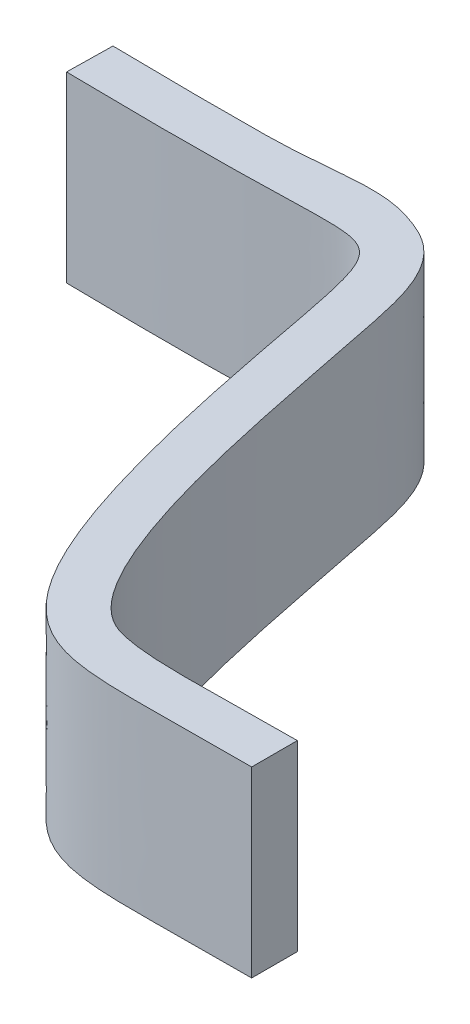
ISO-10303-21;
HEADER;
FILE_DESCRIPTION(('STEP AP214'),'2;1');
FILE_NAME('part.step','',(''),(''),'','','');
FILE_SCHEMA(('AUTOMOTIVE_DESIGN { 1 0 10303 214 1 1 1 1 }'));
ENDSEC;
DATA;
#1=APPLICATION_CONTEXT('core data for automotive mechanical design processes');
#2=APPLICATION_PROTOCOL_DEFINITION('international standard','automotive_design',2000,#1);
#3=PRODUCT_CONTEXT('',#1,'mechanical');
#4=PRODUCT('Part','Part','',(#3));
#5=PRODUCT_RELATED_PRODUCT_CATEGORY('part','',(#4));
#6=PRODUCT_DEFINITION_FORMATION('','',#4);
#7=PRODUCT_DEFINITION_CONTEXT('part definition',#1,'design');
#8=PRODUCT_DEFINITION('design','',#6,#7);
#9=PRODUCT_DEFINITION_SHAPE('','',#8);
#10=(LENGTH_UNIT() NAMED_UNIT(*) SI_UNIT(.MILLI.,.METRE.));
#11=(NAMED_UNIT(*) PLANE_ANGLE_UNIT() SI_UNIT($,.RADIAN.));
#12=(NAMED_UNIT(*) SI_UNIT($,.STERADIAN.) SOLID_ANGLE_UNIT());
#13=UNCERTAINTY_MEASURE_WITH_UNIT(LENGTH_MEASURE(1.E-05),#10,'distance_accuracy_value','');
#14=(GEOMETRIC_REPRESENTATION_CONTEXT(3) GLOBAL_UNCERTAINTY_ASSIGNED_CONTEXT((#13)) GLOBAL_UNIT_ASSIGNED_CONTEXT((#10,
#11,#12)) REPRESENTATION_CONTEXT('',''));
#15=CARTESIAN_POINT('',(0.,0.,0.));
#16=DIRECTION('',(0.,0.,1.));
#17=DIRECTION('',(1.,0.,0.));
#18=AXIS2_PLACEMENT_3D('',#15,#16,#17);
#19=CARTESIAN_POINT('',(-2.,1.7,1.13921942442));
#20=CARTESIAN_POINT('',(-2.,2.1,1.13921942442));
#21=CARTESIAN_POINT('',(-2.18158152961,1.7,1.13921942442));
#22=CARTESIAN_POINT('',(-2.18158152961,2.1,1.13921942442));
#23=CARTESIAN_POINT('',(-2.339977259826,1.7,1.150854652504));
#24=CARTESIAN_POINT('',(-2.339977259826,2.1,1.150854652504));
#25=CARTESIAN_POINT('',(-2.409271822258,1.7,1.123318095939));
#26=CARTESIAN_POINT('',(-2.409271822258,2.1,1.123318095939));
#27=CARTESIAN_POINT('',(-2.45840379781,1.7,1.103793830593));
#28=CARTESIAN_POINT('',(-2.45840379781,2.1,1.103793830593));
#29=CARTESIAN_POINT('',(-2.511871987905,1.7,1.040818355399));
#30=CARTESIAN_POINT('',(-2.511871987905,2.1,1.040818355399));
#31=CARTESIAN_POINT('',(-2.569212385653,1.7,0.870600025063));
#32=CARTESIAN_POINT('',(-2.569212385653,2.1,0.870600025063));
#33=CARTESIAN_POINT('',(-2.636889213231,1.7,0.669697397155));
#34=CARTESIAN_POINT('',(-2.636889213231,2.1,0.669697397155));
#35=CARTESIAN_POINT('',(-2.68220445577,1.7,0.387703808821));
#36=CARTESIAN_POINT('',(-2.68220445577,2.1,0.387703808821));
#37=CARTESIAN_POINT('',(-2.715217064418,1.7,0.238514214424));
#38=CARTESIAN_POINT('',(-2.715217064418,2.1,0.238514214424));
#39=CARTESIAN_POINT('',(-2.733260379936,1.7,0.15697340217));
#40=CARTESIAN_POINT('',(-2.733260379936,2.1,0.15697340217));
#41=CARTESIAN_POINT('',(-2.758287406186,1.7,0.07825906366375));
#42=CARTESIAN_POINT('',(-2.758287406186,2.1,0.07825906366375));
#43=CARTESIAN_POINT('',(-2.832507364887,1.7,0.04274767066664));
#44=CARTESIAN_POINT('',(-2.832507364887,2.1,0.04274767066664));
#45=CARTESIAN_POINT('',(-2.943951276406,1.7,-0.01057395074596));
#46=CARTESIAN_POINT('',(-2.943951276406,2.1,-0.01057395074596));
#47=CARTESIAN_POINT('',(-3.015005277309,1.7,0.0242116979541));
#48=CARTESIAN_POINT('',(-3.015005277309,2.1,0.0242116979541));
#49=CARTESIAN_POINT('',(-3.181036980251,1.7,0.02617699260863));
#50=CARTESIAN_POINT('',(-3.181036980251,2.1,0.02617699260863));
#51=CARTESIAN_POINT('',(-3.270869886935,1.7,0.02724033248999));
#52=CARTESIAN_POINT('',(-3.270869886935,2.1,0.02724033248999));
#53=CARTESIAN_POINT('',(-3.382915435317,1.7,0.02682052362685));
#54=CARTESIAN_POINT('',(-3.382915435317,2.1,0.02682052362685));
#55=CARTESIAN_POINT('',(-3.518196087167,1.7,0.02456956039346));
#56=CARTESIAN_POINT('',(-3.518196087167,2.1,0.02456956039346));
#57=B_SPLINE_SURFACE_WITH_KNOTS('',3,1,((#19,#20),(#21,#22),(#23,#24),(#25,#26),(#27,#28),(#29,
#30),(#31,#32),(#33,#34),(#35,#36),(#37,#38),(#39,#40),(#41,#42),(#43,#44),(#45,#46),(#47,#48),
(#49,#50),(#51,#52),(#53,#54),(#55,#56)),.UNSPECIFIED.,.F.,.F.,.F.,(4,3,3,3,3,3,4),(2,2),(0.,
0.246206941127,0.420775233174,0.626811965837,0.739423053783,0.908512613261,1.),(0.,0.04),.UNSPECIFIED.);
#58=CARTESIAN_POINT('',(-2.,1.7,1.13921942442));
#59=CARTESIAN_POINT('',(-2.18158152961,1.7,1.13921942442));
#60=CARTESIAN_POINT('',(-2.339977259826,1.7,1.150854652504));
#61=CARTESIAN_POINT('',(-2.409271822258,1.7,1.123318095939));
#62=CARTESIAN_POINT('',(-2.45840379781,1.7,1.103793830593));
#63=CARTESIAN_POINT('',(-2.511871987905,1.7,1.040818355399));
#64=CARTESIAN_POINT('',(-2.569212385653,1.7,0.870600025063));
#65=CARTESIAN_POINT('',(-2.636889213231,1.7,0.669697397155));
#66=CARTESIAN_POINT('',(-2.68220445577,1.7,0.387703808821));
#67=CARTESIAN_POINT('',(-2.715217064418,1.7,0.238514214424));
#68=CARTESIAN_POINT('',(-2.733260379936,1.7,0.15697340217));
#69=CARTESIAN_POINT('',(-2.758287406186,1.7,0.07825906366375));
#70=CARTESIAN_POINT('',(-2.832507364887,1.7,0.04274767066664));
#71=CARTESIAN_POINT('',(-2.943951276406,1.7,-0.01057395074596));
#72=CARTESIAN_POINT('',(-3.015005277309,1.7,0.0242116979541));
#73=CARTESIAN_POINT('',(-3.181036980251,1.7,0.02617699260863));
#74=CARTESIAN_POINT('',(-3.270869886935,1.7,0.02724033248999));
#75=CARTESIAN_POINT('',(-3.382915435317,1.7,0.02682052362685));
#76=CARTESIAN_POINT('',(-3.518196087167,1.7,0.02456956039346));
#77=B_SPLINE_CURVE_WITH_KNOTS('',3,(#58,#59,#60,#61,#62,#63,#64,#65,#66,#67,#68,#69,#70,#71,#72,
#73,#74,#75,#76),.UNSPECIFIED.,.F.,.F.,(4,3,3,3,3,3,4),(0.,0.246206941127,0.420775233174,
0.626811965837,0.739423053783,0.908512613261,1.),.UNSPECIFIED.);
#78=CARTESIAN_POINT('',(-2.,1.7,1.13921942442));
#79=VERTEX_POINT('',#78);
#80=CARTESIAN_POINT('',(-3.518196087167,1.7,0.02456956039346));
#81=VERTEX_POINT('',#80);
#82=EDGE_CURVE('E11',#79,#81,#77,.T.);
#83=DIRECTION('',(0.,1.,0.));
#84=VECTOR('',#83,1.);
#85=CARTESIAN_POINT('',(-3.518196087167,1.7,0.02456956039346));
#86=LINE('',#85,#84);
#87=CARTESIAN_POINT('',(-3.518196087167,2.1,0.02456956039346));
#88=VERTEX_POINT('',#87);
#89=EDGE_CURVE('E27',#81,#88,#86,.T.);
#90=CARTESIAN_POINT('',(-2.,2.1,1.13921942442));
#91=CARTESIAN_POINT('',(-2.18158152961,2.1,1.13921942442));
#92=CARTESIAN_POINT('',(-2.339977259826,2.1,1.150854652504));
#93=CARTESIAN_POINT('',(-2.409271822258,2.1,1.123318095939));
#94=CARTESIAN_POINT('',(-2.45840379781,2.1,1.103793830593));
#95=CARTESIAN_POINT('',(-2.511871987905,2.1,1.040818355399));
#96=CARTESIAN_POINT('',(-2.569212385653,2.1,0.870600025063));
#97=CARTESIAN_POINT('',(-2.636889213231,2.1,0.669697397155));
#98=CARTESIAN_POINT('',(-2.68220445577,2.1,0.387703808821));
#99=CARTESIAN_POINT('',(-2.715217064418,2.1,0.238514214424));
#100=CARTESIAN_POINT('',(-2.733260379936,2.1,0.15697340217));
#101=CARTESIAN_POINT('',(-2.758287406186,2.1,0.07825906366375));
#102=CARTESIAN_POINT('',(-2.832507364887,2.1,0.04274767066664));
#103=CARTESIAN_POINT('',(-2.943951276406,2.1,-0.01057395074596));
#104=CARTESIAN_POINT('',(-3.015005277309,2.1,0.0242116979541));
#105=CARTESIAN_POINT('',(-3.181036980251,2.1,0.02617699260863));
#106=CARTESIAN_POINT('',(-3.270869886935,2.1,0.02724033248999));
#107=CARTESIAN_POINT('',(-3.382915435317,2.1,0.02682052362685));
#108=CARTESIAN_POINT('',(-3.518196087167,2.1,0.02456956039346));
#109=B_SPLINE_CURVE_WITH_KNOTS('',3,(#90,#91,#92,#93,#94,#95,#96,#97,#98,#99,#100,#101,#102,
#103,#104,#105,#106,#107,#108),.UNSPECIFIED.,.F.,.F.,(4,3,3,3,3,3,4),(0.,0.246206941127,
0.420775233174,0.626811965837,0.739423053783,0.908512613261,1.),.UNSPECIFIED.);
#110=CARTESIAN_POINT('',(-2.,2.1,1.13921942442));
#111=VERTEX_POINT('',#110);
#112=EDGE_CURVE('E74',#111,#88,#109,.T.);
#113=DIRECTION('',(0.,1.,0.));
#114=VECTOR('',#113,1.);
#115=CARTESIAN_POINT('',(-2.,1.7,1.13921942442));
#116=LINE('',#115,#114);
#117=EDGE_CURVE('E88',#79,#111,#116,.T.);
#118=ORIENTED_EDGE('',*,*,#82,.T.);
#119=ORIENTED_EDGE('',*,*,#89,.T.);
#120=ORIENTED_EDGE('',*,*,#112,.F.);
#121=ORIENTED_EDGE('',*,*,#117,.F.);
#122=EDGE_LOOP('',(#118,#119,#120,#121));
#123=FACE_BOUND('',#122,.T.);
#124=ADVANCED_FACE('F17',(#123),#57,.T.);
#125=CARTESIAN_POINT('',(-2.,1.7,1.23921942442));
#126=DIRECTION('',(1.,0.,0.));
#127=DIRECTION('',(0.,0.,-1.));
#128=AXIS2_PLACEMENT_3D('',#125,#126,#127);
#129=PLANE('',#128);
#130=DIRECTION('',(0.,0.,-1.));
#131=VECTOR('',#130,1.);
#132=CARTESIAN_POINT('',(-2.,1.7,1.23921942442));
#133=LINE('',#132,#131);
#134=CARTESIAN_POINT('',(-2.,1.7,1.23921942442));
#135=VERTEX_POINT('',#134);
#136=EDGE_CURVE('E90',#135,#79,#133,.T.);
#137=ORIENTED_EDGE('',*,*,#136,.T.);
#138=ORIENTED_EDGE('',*,*,#117,.T.);
#139=DIRECTION('',(0.,0.,-1.));
#140=VECTOR('',#139,1.);
#141=CARTESIAN_POINT('',(-2.,2.1,1.23921942442));
#142=LINE('',#141,#140);
#143=CARTESIAN_POINT('',(-2.,2.1,1.23921942442));
#144=VERTEX_POINT('',#143);
#145=EDGE_CURVE('E69',#144,#111,#142,.T.);
#146=ORIENTED_EDGE('',*,*,#145,.F.);
#147=DIRECTION('',(0.,1.,0.));
#148=VECTOR('',#147,1.);
#149=CARTESIAN_POINT('',(-2.,1.7,1.23921942442));
#150=LINE('',#149,#148);
#151=EDGE_CURVE('E65',#135,#144,#150,.T.);
#152=ORIENTED_EDGE('',*,*,#151,.F.);
#153=EDGE_LOOP('',(#137,#138,#146,#152));
#154=FACE_BOUND('',#153,.T.);
#155=ADVANCED_FACE('F118',(#154),#129,.T.);
#156=CARTESIAN_POINT('',(-3.519859777919,1.7,0.124555720101));
#157=CARTESIAN_POINT('',(-3.519859777919,2.1,0.124555720101));
#158=CARTESIAN_POINT('',(-3.484196375784,1.7,0.125149130954));
#159=CARTESIAN_POINT('',(-3.484196375784,2.1,0.125149130954));
#160=CARTESIAN_POINT('',(-3.415477459261,1.7,0.1261364134));
#161=CARTESIAN_POINT('',(-3.415477459261,2.1,0.1261364134));
#162=CARTESIAN_POINT('',(-3.320222673034,1.7,0.127018884246));
#163=CARTESIAN_POINT('',(-3.320222673034,2.1,0.127018884246));
#164=CARTESIAN_POINT('',(-3.208813635463,1.7,0.126964934446));
#165=CARTESIAN_POINT('',(-3.208813635463,2.1,0.126964934446));
#166=CARTESIAN_POINT('',(-3.09500147233,1.7,0.125052548686));
#167=CARTESIAN_POINT('',(-3.09500147233,2.1,0.125052548686));
#168=CARTESIAN_POINT('',(-3.005502310383,1.7,0.122211643591));
#169=CARTESIAN_POINT('',(-3.005502310383,2.1,0.122211643591));
#170=CARTESIAN_POINT('',(-2.938379190163,1.7,0.120572811056));
#171=CARTESIAN_POINT('',(-2.938379190163,2.1,0.120572811056));
#172=CARTESIAN_POINT('',(-2.890736977155,1.7,0.12382204641));
#173=CARTESIAN_POINT('',(-2.890736977155,2.1,0.12382204641));
#174=CARTESIAN_POINT('',(-2.858384626742,1.7,0.137975416595));
#175=CARTESIAN_POINT('',(-2.858384626742,2.1,0.137975416595));
#176=CARTESIAN_POINT('',(-2.83614987913,1.7,0.170461165875));
#177=CARTESIAN_POINT('',(-2.83614987913,2.1,0.170461165875));
#178=CARTESIAN_POINT('',(-2.818720998467,1.7,0.227797715975));
#179=CARTESIAN_POINT('',(-2.818720998467,2.1,0.227797715975));
#180=CARTESIAN_POINT('',(-2.801283372441,1.7,0.313831440523));
#181=CARTESIAN_POINT('',(-2.801283372441,2.1,0.313831440523));
#182=CARTESIAN_POINT('',(-2.780342009727,1.7,0.427338590742));
#183=CARTESIAN_POINT('',(-2.780342009727,2.1,0.427338590742));
#184=CARTESIAN_POINT('',(-2.754154341827,1.7,0.561022608959));
#185=CARTESIAN_POINT('',(-2.754154341827,2.1,0.561022608959));
#186=CARTESIAN_POINT('',(-2.722185051624,1.7,0.704147615704));
#187=CARTESIAN_POINT('',(-2.722185051624,2.1,0.704147615704));
#188=CARTESIAN_POINT('',(-2.684760218542,1.7,0.8444133442));
#189=CARTESIAN_POINT('',(-2.684760218542,2.1,0.8444133442));
#190=CARTESIAN_POINT('',(-2.642642785364,1.7,0.970195537173));
#191=CARTESIAN_POINT('',(-2.642642785364,2.1,0.970195537173));
#192=CARTESIAN_POINT('',(-2.596679826283,1.7,1.072414658047));
#193=CARTESIAN_POINT('',(-2.596679826283,2.1,1.072414658047));
#194=CARTESIAN_POINT('',(-2.547351049529,1.7,1.147120058622));
#195=CARTESIAN_POINT('',(-2.547351049529,2.1,1.147120058622));
#196=CARTESIAN_POINT('',(-2.49463107148,1.7,1.195835970354));
#197=CARTESIAN_POINT('',(-2.49463107148,2.1,1.195835970354));
#198=CARTESIAN_POINT('',(-2.438208681578,1.7,1.223329336306));
#199=CARTESIAN_POINT('',(-2.438208681578,2.1,1.223329336306));
#200=CARTESIAN_POINT('',(-2.377616950117,1.7,1.236042062695));
#201=CARTESIAN_POINT('',(-2.377616950117,2.1,1.236042062695));
#202=CARTESIAN_POINT('',(-2.312389233495,1.7,1.240388702947));
#203=CARTESIAN_POINT('',(-2.312389233495,2.1,1.240388702947));
#204=CARTESIAN_POINT('',(-2.242230744158,1.7,1.240862327674));
#205=CARTESIAN_POINT('',(-2.242230744158,2.1,1.240862327674));
#206=CARTESIAN_POINT('',(-2.167007361665,1.7,1.240072265277));
#207=CARTESIAN_POINT('',(-2.167007361665,2.1,1.240072265277));
#208=CARTESIAN_POINT('',(-2.102746349675,1.7,1.239487655145));
#209=CARTESIAN_POINT('',(-2.102746349675,2.1,1.239487655145));
#210=CARTESIAN_POINT('',(-2.052261213181,1.7,1.239268159911));
#211=CARTESIAN_POINT('',(-2.052261213181,2.1,1.239268159911));
#212=CARTESIAN_POINT('',(-2.017589552929,1.7,1.23921942442));
#213=CARTESIAN_POINT('',(-2.017589552929,2.1,1.23921942442));
#214=CARTESIAN_POINT('',(-2.,1.7,1.23921942442));
#215=CARTESIAN_POINT('',(-2.,2.1,1.23921942442));
#216=B_SPLINE_SURFACE_WITH_KNOTS('',5,1,((#156,#157),(#158,#159),(#160,#161),(#162,#163),(#164,
#165),(#166,#167),(#168,#169),(#170,#171),(#172,#173),(#174,#175),(#176,#177),(#178,#179),(#180,
#181),(#182,#183),(#184,#185),(#186,#187),(#188,#189),(#190,#191),(#192,#193),(#194,#195),(#196,
#197),(#198,#199),(#200,#201),(#202,#203),(#204,#205),(#206,#207),(#208,#209),(#210,#211),(#212,
#213),(#214,#215)),.UNSPECIFIED.,.F.,.F.,.F.,(6,1,1,1,1,1,1,1,1,1,1,1,1,1,1,1,1,1,1,1,1,1,1,1,1,
6),(2,2),(-1.,-0.96,-0.92,-0.88,-0.84,-0.8,-0.76,-0.72,-0.68,-0.64,-0.6,-0.56,-0.52,-0.48,-0.44,
-0.4,-0.36,-0.32,-0.28,-0.24,-0.2,-0.16,-0.12,-0.08,-0.04,0.),(0.,0.04),.UNSPECIFIED.);
#217=CARTESIAN_POINT('',(-2.,1.7,1.23921942442));
#218=CARTESIAN_POINT('',(-2.017589552929,1.7,1.23921942442));
#219=CARTESIAN_POINT('',(-2.052261213181,1.7,1.239268159911));
#220=CARTESIAN_POINT('',(-2.102746349675,1.7,1.239487655145));
#221=CARTESIAN_POINT('',(-2.167007361665,1.7,1.240072265277));
#222=CARTESIAN_POINT('',(-2.242230744158,1.7,1.240862327674));
#223=CARTESIAN_POINT('',(-2.312389233495,1.7,1.240388702947));
#224=CARTESIAN_POINT('',(-2.377616950117,1.7,1.236042062695));
#225=CARTESIAN_POINT('',(-2.438208681578,1.7,1.223329336306));
#226=CARTESIAN_POINT('',(-2.49463107148,1.7,1.195835970354));
#227=CARTESIAN_POINT('',(-2.547351049529,1.7,1.147120058622));
#228=CARTESIAN_POINT('',(-2.596679826283,1.7,1.072414658047));
#229=CARTESIAN_POINT('',(-2.642642785364,1.7,0.970195537173));
#230=CARTESIAN_POINT('',(-2.684760218542,1.7,0.8444133442));
#231=CARTESIAN_POINT('',(-2.722185051624,1.7,0.704147615704));
#232=CARTESIAN_POINT('',(-2.754154341827,1.7,0.561022608959));
#233=CARTESIAN_POINT('',(-2.780342009727,1.7,0.427338590742));
#234=CARTESIAN_POINT('',(-2.801283372441,1.7,0.313831440523));
#235=CARTESIAN_POINT('',(-2.818720998467,1.7,0.227797715975));
#236=CARTESIAN_POINT('',(-2.83614987913,1.7,0.170461165875));
#237=CARTESIAN_POINT('',(-2.858384626742,1.7,0.137975416595));
#238=CARTESIAN_POINT('',(-2.890736977155,1.7,0.12382204641));
#239=CARTESIAN_POINT('',(-2.938379190163,1.7,0.120572811056));
#240=CARTESIAN_POINT('',(-3.005502310383,1.7,0.122211643591));
#241=CARTESIAN_POINT('',(-3.09500147233,1.7,0.125052548686));
#242=CARTESIAN_POINT('',(-3.208813635463,1.7,0.126964934446));
#243=CARTESIAN_POINT('',(-3.320222673034,1.7,0.127018884246));
#244=CARTESIAN_POINT('',(-3.415477459261,1.7,0.1261364134));
#245=CARTESIAN_POINT('',(-3.484196375784,1.7,0.125149130954));
#246=CARTESIAN_POINT('',(-3.519859777919,1.7,0.124555720101));
#247=B_SPLINE_CURVE_WITH_KNOTS('',5,(#217,#218,#219,#220,#221,#222,#223,#224,#225,#226,#227,
#228,#229,#230,#231,#232,#233,#234,#235,#236,#237,#238,#239,#240,#241,#242,#243,#244,#245,#246),
.UNSPECIFIED.,.F.,.F.,(6,1,1,1,1,1,1,1,1,1,1,1,1,1,1,1,1,1,1,1,1,1,1,1,1,6),(0.,0.04,0.08,0.12,
0.16,0.2,0.24,0.28,0.32,0.36,0.4,0.44,0.48,0.52,0.56,0.6,0.64,0.68,0.72,0.76,0.8,0.84,0.88,0.92,
0.96,1.),.UNSPECIFIED.);
#248=CARTESIAN_POINT('',(-3.519859777919,1.7,0.124555720101));
#249=VERTEX_POINT('',#248);
#250=EDGE_CURVE('E55',#135,#249,#247,.T.);
#251=CARTESIAN_POINT('',(-3.519859777919,2.1,0.124555720101));
#252=CARTESIAN_POINT('',(-3.484196375784,2.1,0.125149130954));
#253=CARTESIAN_POINT('',(-3.415477459261,2.1,0.1261364134));
#254=CARTESIAN_POINT('',(-3.320222673034,2.1,0.127018884246));
#255=CARTESIAN_POINT('',(-3.208813635463,2.1,0.126964934446));
#256=CARTESIAN_POINT('',(-3.09500147233,2.1,0.125052548686));
#257=CARTESIAN_POINT('',(-3.005502310383,2.1,0.122211643591));
#258=CARTESIAN_POINT('',(-2.938379190163,2.1,0.120572811056));
#259=CARTESIAN_POINT('',(-2.890736977155,2.1,0.12382204641));
#260=CARTESIAN_POINT('',(-2.858384626742,2.1,0.137975416595));
#261=CARTESIAN_POINT('',(-2.83614987913,2.1,0.170461165875));
#262=CARTESIAN_POINT('',(-2.818720998467,2.1,0.227797715975));
#263=CARTESIAN_POINT('',(-2.801283372441,2.1,0.313831440523));
#264=CARTESIAN_POINT('',(-2.780342009727,2.1,0.427338590742));
#265=CARTESIAN_POINT('',(-2.754154341827,2.1,0.561022608959));
#266=CARTESIAN_POINT('',(-2.722185051624,2.1,0.704147615704));
#267=CARTESIAN_POINT('',(-2.684760218542,2.1,0.8444133442));
#268=CARTESIAN_POINT('',(-2.642642785364,2.1,0.970195537173));
#269=CARTESIAN_POINT('',(-2.596679826283,2.1,1.072414658047));
#270=CARTESIAN_POINT('',(-2.547351049529,2.1,1.147120058622));
#271=CARTESIAN_POINT('',(-2.49463107148,2.1,1.195835970354));
#272=CARTESIAN_POINT('',(-2.438208681578,2.1,1.223329336306));
#273=CARTESIAN_POINT('',(-2.377616950117,2.1,1.236042062695));
#274=CARTESIAN_POINT('',(-2.312389233495,2.1,1.240388702947));
#275=CARTESIAN_POINT('',(-2.242230744158,2.1,1.240862327674));
#276=CARTESIAN_POINT('',(-2.167007361665,2.1,1.240072265277));
#277=CARTESIAN_POINT('',(-2.102746349675,2.1,1.239487655145));
#278=CARTESIAN_POINT('',(-2.052261213181,2.1,1.239268159911));
#279=CARTESIAN_POINT('',(-2.017589552929,2.1,1.23921942442));
#280=CARTESIAN_POINT('',(-2.,2.1,1.23921942442));
#281=B_SPLINE_CURVE_WITH_KNOTS('',5,(#251,#252,#253,#254,#255,#256,#257,#258,#259,#260,#261,
#262,#263,#264,#265,#266,#267,#268,#269,#270,#271,#272,#273,#274,#275,#276,#277,#278,#279,#280),
.UNSPECIFIED.,.F.,.F.,(6,1,1,1,1,1,1,1,1,1,1,1,1,1,1,1,1,1,1,1,1,1,1,1,1,6),(-1.,-0.96,-0.92,
-0.88,-0.84,-0.8,-0.76,-0.72,-0.68,-0.64,-0.6,-0.56,-0.52,-0.48,-0.44,-0.4,-0.36,-0.32,-0.28,
-0.24,-0.2,-0.16,-0.12,-0.08,-0.04,0.),.UNSPECIFIED.);
#282=CARTESIAN_POINT('',(-3.519859777919,2.1,0.124555720101));
#283=VERTEX_POINT('',#282);
#284=EDGE_CURVE('E61',#283,#144,#281,.T.);
#285=DIRECTION('',(0.,1.,0.));
#286=VECTOR('',#285,1.);
#287=CARTESIAN_POINT('',(-3.519859777919,1.7,0.124555720101));
#288=LINE('',#287,#286);
#289=EDGE_CURVE('E64',#249,#283,#288,.T.);
#290=ORIENTED_EDGE('',*,*,#250,.F.);
#291=ORIENTED_EDGE('',*,*,#151,.T.);
#292=ORIENTED_EDGE('',*,*,#284,.F.);
#293=ORIENTED_EDGE('',*,*,#289,.F.);
#294=EDGE_LOOP('',(#290,#291,#292,#293));
#295=FACE_BOUND('',#294,.T.);
#296=ADVANCED_FACE('F63',(#295),#216,.T.);
#297=CARTESIAN_POINT('',(-3.518196087167,1.7,0.02456956039346));
#298=DIRECTION('',(-0.999861597076472,0.,-0.0166369075157079));
#299=DIRECTION('',(-0.0166369075157079,0.,0.999861597076472));
#300=AXIS2_PLACEMENT_3D('',#297,#298,#299);
#301=PLANE('',#300);
#302=DIRECTION('',(0.0166369075157079,0.,-0.999861597076472));
#303=VECTOR('',#302,1.);
#304=CARTESIAN_POINT('',(-3.519859777919,1.7,0.124555720101));
#305=LINE('',#304,#303);
#306=EDGE_CURVE('E72',#249,#81,#305,.T.);
#307=ORIENTED_EDGE('',*,*,#306,.F.);
#308=ORIENTED_EDGE('',*,*,#289,.T.);
#309=DIRECTION('',(-0.0166369075157079,0.,0.999861597076472));
#310=VECTOR('',#309,1.);
#311=CARTESIAN_POINT('',(-3.519859777919,2.1,0.124555720101));
#312=LINE('',#311,#310);
#313=EDGE_CURVE('E21',#88,#283,#312,.T.);
#314=ORIENTED_EDGE('',*,*,#313,.F.);
#315=ORIENTED_EDGE('',*,*,#89,.F.);
#316=EDGE_LOOP('',(#307,#308,#314,#315));
#317=FACE_BOUND('',#316,.T.);
#318=ADVANCED_FACE('F71',(#317),#301,.T.);
#319=CARTESIAN_POINT('',(-2.759929888959,1.7,0.615144188464));
#320=DIRECTION('',(0.,-1.,0.));
#321=DIRECTION('',(1.,0.,0.));
#322=AXIS2_PLACEMENT_3D('',#319,#320,#321);
#323=PLANE('',#322);
#324=ORIENTED_EDGE('',*,*,#306,.T.);
#325=ORIENTED_EDGE('',*,*,#82,.F.);
#326=ORIENTED_EDGE('',*,*,#136,.F.);
#327=ORIENTED_EDGE('',*,*,#250,.T.);
#328=EDGE_LOOP('',(#324,#325,#326,#327));
#329=FACE_BOUND('',#328,.T.);
#330=ADVANCED_FACE('F109',(#329),#323,.T.);
#331=CARTESIAN_POINT('',(-2.759929888959,2.1,0.615144188464));
#332=DIRECTION('',(0.,-1.,0.));
#333=DIRECTION('',(1.,0.,0.));
#334=AXIS2_PLACEMENT_3D('',#331,#332,#333);
#335=PLANE('',#334);
#336=ORIENTED_EDGE('',*,*,#313,.T.);
#337=ORIENTED_EDGE('',*,*,#284,.T.);
#338=ORIENTED_EDGE('',*,*,#145,.T.);
#339=ORIENTED_EDGE('',*,*,#112,.T.);
#340=EDGE_LOOP('',(#336,#337,#338,#339));
#341=FACE_BOUND('',#340,.T.);
#342=ADVANCED_FACE('F19',(#341),#335,.F.);
#343=CLOSED_SHELL('',(#124,#155,#296,#318,#330,#342));
#344=MANIFOLD_SOLID_BREP('B1',#343);
#345=ADVANCED_BREP_SHAPE_REPRESENTATION('',(#18,#344),#14);
#346=SHAPE_DEFINITION_REPRESENTATION(#9,#345);
ENDSEC;
END-ISO-10303-21;
